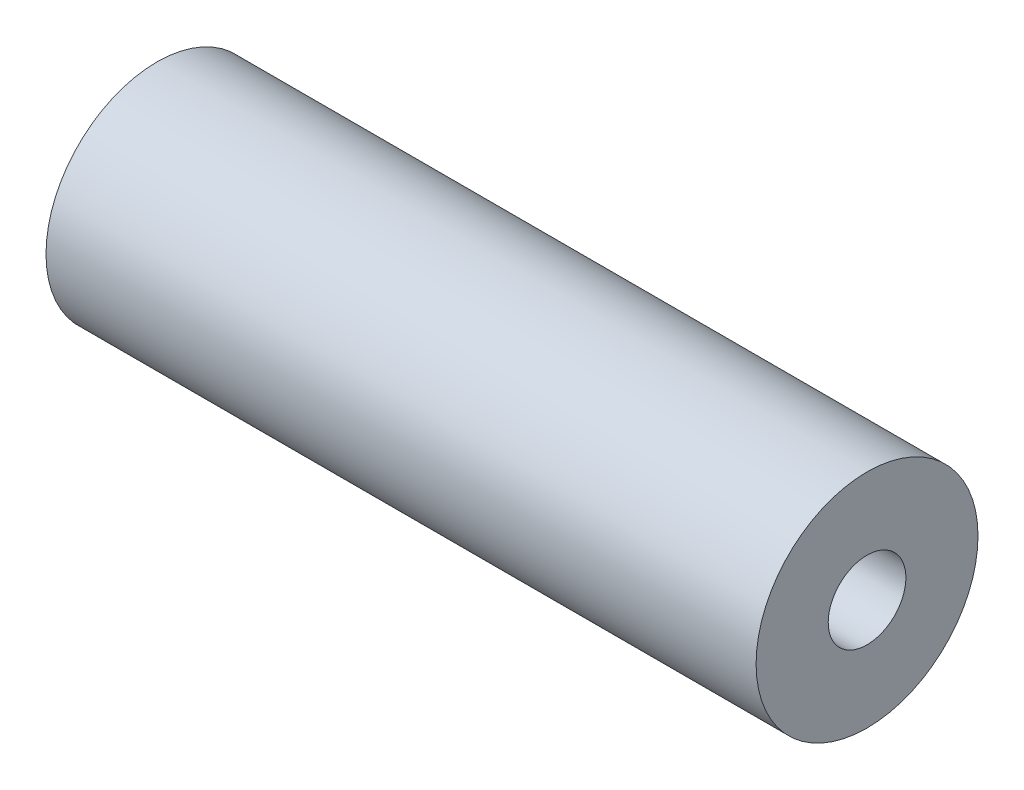
ISO-10303-21;
HEADER;
FILE_DESCRIPTION(('STEP AP214'),'2;1');
FILE_NAME('part.step','',(''),(''),'','','');
FILE_SCHEMA(('AUTOMOTIVE_DESIGN { 1 0 10303 214 1 1 1 1 }'));
ENDSEC;
DATA;
#1=APPLICATION_CONTEXT('core data for automotive mechanical design processes');
#2=APPLICATION_PROTOCOL_DEFINITION('international standard','automotive_design',2000,#1);
#3=PRODUCT_CONTEXT('',#1,'mechanical');
#4=PRODUCT('Part','Part','',(#3));
#5=PRODUCT_RELATED_PRODUCT_CATEGORY('part','',(#4));
#6=PRODUCT_DEFINITION_FORMATION('','',#4);
#7=PRODUCT_DEFINITION_CONTEXT('part definition',#1,'design');
#8=PRODUCT_DEFINITION('design','',#6,#7);
#9=PRODUCT_DEFINITION_SHAPE('','',#8);
#10=(LENGTH_UNIT() NAMED_UNIT(*) SI_UNIT(.MILLI.,.METRE.));
#11=(NAMED_UNIT(*) PLANE_ANGLE_UNIT() SI_UNIT($,.RADIAN.));
#12=(NAMED_UNIT(*) SI_UNIT($,.STERADIAN.) SOLID_ANGLE_UNIT());
#13=UNCERTAINTY_MEASURE_WITH_UNIT(LENGTH_MEASURE(1.E-05),#10,'distance_accuracy_value','');
#14=(GEOMETRIC_REPRESENTATION_CONTEXT(3) GLOBAL_UNCERTAINTY_ASSIGNED_CONTEXT((#13)) GLOBAL_UNIT_ASSIGNED_CONTEXT((#10,
#11,#12)) REPRESENTATION_CONTEXT('',''));
#15=CARTESIAN_POINT('',(0.,0.,0.));
#16=DIRECTION('',(0.,0.,1.));
#17=DIRECTION('',(1.,0.,0.));
#18=AXIS2_PLACEMENT_3D('',#15,#16,#17);
#19=CARTESIAN_POINT('',(0.,0.,0.));
#20=DIRECTION('',(-1.,0.,0.));
#21=DIRECTION('',(0.,0.,1.));
#22=AXIS2_PLACEMENT_3D('',#19,#20,#21);
#23=CYLINDRICAL_SURFACE('',#22,5.);
#24=CARTESIAN_POINT('',(0.,0.,0.));
#25=DIRECTION('',(-1.,0.,0.));
#26=DIRECTION('',(0.,0.,1.));
#27=AXIS2_PLACEMENT_3D('',#24,#25,#26);
#28=CIRCLE('',#27,5.);
#29=CARTESIAN_POINT('',(0.,0.,5.));
#30=VERTEX_POINT('',#29);
#31=EDGE_CURVE('E10',#30,#30,#28,.T.);
#32=ORIENTED_EDGE('',*,*,#31,.F.);
#33=EDGE_LOOP('',(#32));
#34=FACE_BOUND('',#33,.T.);
#35=CARTESIAN_POINT('',(32.,0.,0.));
#36=DIRECTION('',(-1.,0.,0.));
#37=DIRECTION('',(0.,0.,1.));
#38=AXIS2_PLACEMENT_3D('',#35,#36,#37);
#39=CIRCLE('',#38,5.);
#40=CARTESIAN_POINT('',(32.,0.,5.));
#41=VERTEX_POINT('',#40);
#42=EDGE_CURVE('E44',#41,#41,#39,.T.);
#43=ORIENTED_EDGE('',*,*,#42,.T.);
#44=EDGE_LOOP('',(#43));
#45=FACE_BOUND('',#44,.T.);
#46=ADVANCED_FACE('F30',(#34,#45),#23,.T.);
#47=CARTESIAN_POINT('',(0.,5.,0.));
#48=DIRECTION('',(1.,0.,0.));
#49=DIRECTION('',(0.,0.,-1.));
#50=AXIS2_PLACEMENT_3D('',#47,#48,#49);
#51=PLANE('',#50);
#52=CARTESIAN_POINT('',(0.,0.,0.));
#53=DIRECTION('',(-1.,0.,0.));
#54=DIRECTION('',(0.,0.,1.));
#55=AXIS2_PLACEMENT_3D('',#52,#53,#54);
#56=CIRCLE('',#55,1.75);
#57=CARTESIAN_POINT('',(0.,0.,1.75));
#58=VERTEX_POINT('',#57);
#59=EDGE_CURVE('E36',#58,#58,#56,.T.);
#60=ORIENTED_EDGE('',*,*,#59,.F.);
#61=EDGE_LOOP('',(#60));
#62=FACE_BOUND('',#61,.T.);
#63=ORIENTED_EDGE('',*,*,#31,.T.);
#64=EDGE_LOOP('',(#63));
#65=FACE_BOUND('',#64,.T.);
#66=ADVANCED_FACE('F59',(#62,#65),#51,.F.);
#67=CARTESIAN_POINT('',(0.,0.,0.));
#68=DIRECTION('',(-1.,0.,0.));
#69=DIRECTION('',(0.,0.,1.));
#70=AXIS2_PLACEMENT_3D('',#67,#68,#69);
#71=CYLINDRICAL_SURFACE('',#70,1.75);
#72=CARTESIAN_POINT('',(32.,0.,0.));
#73=DIRECTION('',(-1.,0.,0.));
#74=DIRECTION('',(0.,0.,1.));
#75=AXIS2_PLACEMENT_3D('',#72,#73,#74);
#76=CIRCLE('',#75,1.75);
#77=CARTESIAN_POINT('',(32.,0.,1.75));
#78=VERTEX_POINT('',#77);
#79=EDGE_CURVE('E40',#78,#78,#76,.T.);
#80=ORIENTED_EDGE('',*,*,#79,.F.);
#81=EDGE_LOOP('',(#80));
#82=FACE_BOUND('',#81,.T.);
#83=ORIENTED_EDGE('',*,*,#59,.T.);
#84=EDGE_LOOP('',(#83));
#85=FACE_BOUND('',#84,.T.);
#86=ADVANCED_FACE('F54',(#82,#85),#71,.F.);
#87=CARTESIAN_POINT('',(32.,1.75,0.));
#88=DIRECTION('',(-1.,0.,0.));
#89=DIRECTION('',(0.,0.,1.));
#90=AXIS2_PLACEMENT_3D('',#87,#88,#89);
#91=PLANE('',#90);
#92=ORIENTED_EDGE('',*,*,#42,.F.);
#93=EDGE_LOOP('',(#92));
#94=FACE_BOUND('',#93,.T.);
#95=ORIENTED_EDGE('',*,*,#79,.T.);
#96=EDGE_LOOP('',(#95));
#97=FACE_BOUND('',#96,.T.);
#98=ADVANCED_FACE('F51',(#94,#97),#91,.F.);
#99=CLOSED_SHELL('',(#46,#66,#86,#98));
#100=MANIFOLD_SOLID_BREP('B2',#99);
#101=ADVANCED_BREP_SHAPE_REPRESENTATION('',(#18,#100),#14);
#102=SHAPE_DEFINITION_REPRESENTATION(#9,#101);
ENDSEC;
END-ISO-10303-21;
